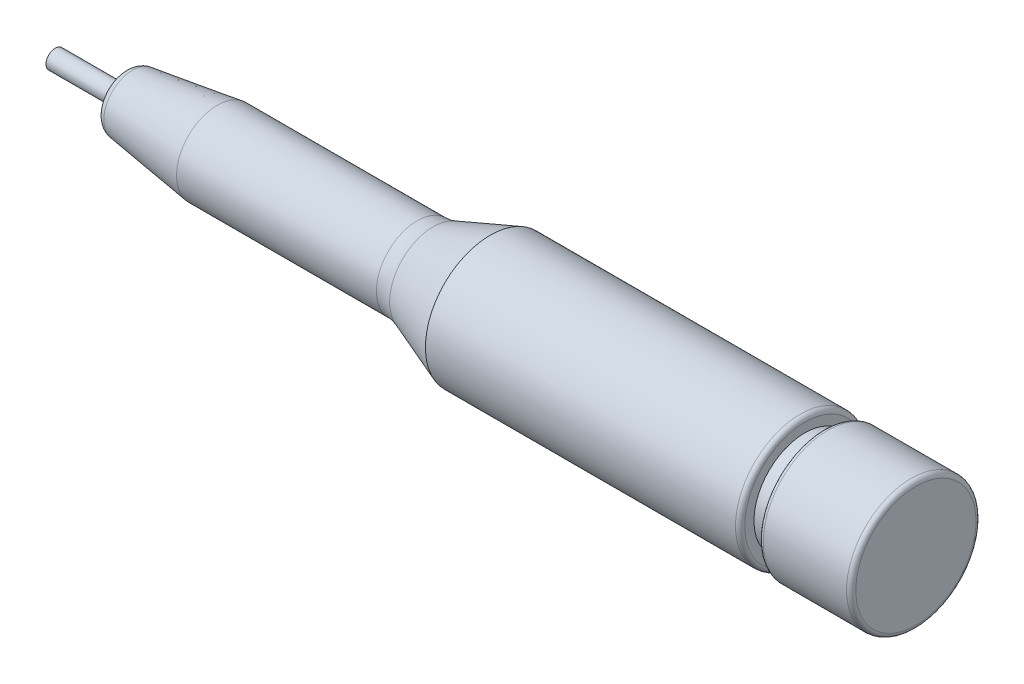
ISO-10303-21;
HEADER;
FILE_DESCRIPTION(('STEP AP214'),'2;1');
FILE_NAME('part.step','',(''),(''),'','','');
FILE_SCHEMA(('AUTOMOTIVE_DESIGN { 1 0 10303 214 1 1 1 1 }'));
ENDSEC;
DATA;
#1=APPLICATION_CONTEXT('core data for automotive mechanical design processes');
#2=APPLICATION_PROTOCOL_DEFINITION('international standard','automotive_design',2000,#1);
#3=PRODUCT_CONTEXT('',#1,'mechanical');
#4=PRODUCT('Part','Part','',(#3));
#5=PRODUCT_RELATED_PRODUCT_CATEGORY('part','',(#4));
#6=PRODUCT_DEFINITION_FORMATION('','',#4);
#7=PRODUCT_DEFINITION_CONTEXT('part definition',#1,'design');
#8=PRODUCT_DEFINITION('design','',#6,#7);
#9=PRODUCT_DEFINITION_SHAPE('','',#8);
#10=(LENGTH_UNIT() NAMED_UNIT(*) SI_UNIT(.MILLI.,.METRE.));
#11=(NAMED_UNIT(*) PLANE_ANGLE_UNIT() SI_UNIT($,.RADIAN.));
#12=(NAMED_UNIT(*) SI_UNIT($,.STERADIAN.) SOLID_ANGLE_UNIT());
#13=UNCERTAINTY_MEASURE_WITH_UNIT(LENGTH_MEASURE(1.E-05),#10,'distance_accuracy_value','');
#14=(GEOMETRIC_REPRESENTATION_CONTEXT(3) GLOBAL_UNCERTAINTY_ASSIGNED_CONTEXT((#13)) GLOBAL_UNIT_ASSIGNED_CONTEXT((#10,
#11,#12)) REPRESENTATION_CONTEXT('',''));
#15=CARTESIAN_POINT('',(0.,0.,0.));
#16=DIRECTION('',(0.,0.,1.));
#17=DIRECTION('',(1.,0.,0.));
#18=AXIS2_PLACEMENT_3D('',#15,#16,#17);
#19=CARTESIAN_POINT('',(0.,0.,0.));
#20=DIRECTION('',(-1.,0.,0.));
#21=DIRECTION('',(0.,0.,0.999999999999999));
#22=AXIS2_PLACEMENT_3D('',#19,#20,#21);
#23=PLANE('',#22);
#24=CARTESIAN_POINT('',(0.,0.,0.));
#25=DIRECTION('',(1.,0.,0.));
#26=DIRECTION('',(0.,0.,-0.999999999999999));
#27=AXIS2_PLACEMENT_3D('',#24,#25,#26);
#28=CIRCLE('',#27,1.);
#29=CARTESIAN_POINT('',(0.,0.,-0.999999999999999));
#30=VERTEX_POINT('',#29);
#31=EDGE_CURVE('E86',#30,#30,#28,.T.);
#32=ORIENTED_EDGE('',*,*,#31,.F.);
#33=EDGE_LOOP('',(#32));
#34=FACE_BOUND('',#33,.T.);
#35=ADVANCED_FACE('F48',(#34),#23,.T.);
#36=CARTESIAN_POINT('',(93.,0.,0.));
#37=DIRECTION('',(1.,0.,0.));
#38=DIRECTION('',(0.,0.,-0.999999999999999));
#39=AXIS2_PLACEMENT_3D('',#36,#37,#38);
#40=CYLINDRICAL_SURFACE('',#39,1.);
#41=ORIENTED_EDGE('',*,*,#31,.T.);
#42=EDGE_LOOP('',(#41));
#43=FACE_BOUND('',#42,.T.);
#44=CARTESIAN_POINT('',(7.50000000000001,0.,0.));
#45=DIRECTION('',(1.,0.,0.));
#46=DIRECTION('',(0.,0.,-0.999999999999999));
#47=AXIS2_PLACEMENT_3D('',#44,#45,#46);
#48=CIRCLE('',#47,1.);
#49=CARTESIAN_POINT('',(7.50000000000001,0.,-0.999999999999999));
#50=VERTEX_POINT('',#49);
#51=EDGE_CURVE('E89',#50,#50,#48,.T.);
#52=ORIENTED_EDGE('',*,*,#51,.F.);
#53=EDGE_LOOP('',(#52));
#54=FACE_BOUND('',#53,.T.);
#55=ADVANCED_FACE('F122',(#43,#54),#40,.T.);
#56=CARTESIAN_POINT('',(7.50000000000001,1.00000000000001,0.));
#57=DIRECTION('',(-1.,0.,0.));
#58=DIRECTION('',(0.,0.,0.999999999999999));
#59=AXIS2_PLACEMENT_3D('',#56,#57,#58);
#60=PLANE('',#59);
#61=CARTESIAN_POINT('',(7.50000000000001,0.,0.));
#62=DIRECTION('',(-1.,0.,0.));
#63=DIRECTION('',(0.,0.,0.999999999999999));
#64=AXIS2_PLACEMENT_3D('',#61,#62,#63);
#65=CIRCLE('',#64,2.13024755509085);
#66=CARTESIAN_POINT('',(7.50000000000001,0.,2.13024755509085));
#67=VERTEX_POINT('',#66);
#68=EDGE_CURVE('E74',#67,#67,#65,.T.);
#69=ORIENTED_EDGE('',*,*,#68,.T.);
#70=EDGE_LOOP('',(#69));
#71=FACE_BOUND('',#70,.T.);
#72=ORIENTED_EDGE('',*,*,#51,.T.);
#73=EDGE_LOOP('',(#72));
#74=FACE_BOUND('',#73,.T.);
#75=ADVANCED_FACE('F128',(#71,#74),#60,.T.);
#76=CARTESIAN_POINT('',(17.5,0.,0.));
#77=DIRECTION('',(1.,0.,0.));
#78=DIRECTION('',(0.,0.,-0.999999999999999));
#79=AXIS2_PLACEMENT_3D('',#76,#77,#78);
#80=CONICAL_SURFACE('',#79,4.4,0.139095941482071);
#81=CARTESIAN_POINT('',(8.3613521554656,0.,0.));
#82=DIRECTION('',(-1.,0.,0.));
#83=DIRECTION('',(0.,0.,0.999999999999999));
#84=AXIS2_PLACEMENT_3D('',#81,#82,#83);
#85=CIRCLE('',#84,3.12058930176518);
#86=CARTESIAN_POINT('',(8.3613521554656,0.,3.12058930176518));
#87=VERTEX_POINT('',#86);
#88=EDGE_CURVE('E77',#87,#87,#85,.F.);
#89=ORIENTED_EDGE('',*,*,#88,.T.);
#90=EDGE_LOOP('',(#89));
#91=FACE_BOUND('',#90,.T.);
#92=CARTESIAN_POINT('',(17.5,0.,0.));
#93=DIRECTION('',(1.,0.,0.));
#94=DIRECTION('',(0.,0.,-0.999999999999999));
#95=AXIS2_PLACEMENT_3D('',#92,#93,#94);
#96=CIRCLE('',#95,4.4);
#97=CARTESIAN_POINT('',(17.5,0.,-4.39999999999999));
#98=VERTEX_POINT('',#97);
#99=EDGE_CURVE('E92',#98,#98,#96,.T.);
#100=ORIENTED_EDGE('',*,*,#99,.F.);
#101=EDGE_LOOP('',(#100));
#102=FACE_BOUND('',#101,.T.);
#103=ADVANCED_FACE('F211',(#91,#102),#80,.T.);
#104=CARTESIAN_POINT('',(93.,0.,0.));
#105=DIRECTION('',(1.,0.,0.));
#106=DIRECTION('',(0.,0.,-0.999999999999999));
#107=AXIS2_PLACEMENT_3D('',#104,#105,#106);
#108=CYLINDRICAL_SURFACE('',#107,4.4);
#109=CARTESIAN_POINT('',(39.1014194595427,0.,0.));
#110=DIRECTION('',(1.,0.,0.));
#111=DIRECTION('',(0.,0.,-0.999999999999999));
#112=AXIS2_PLACEMENT_3D('',#109,#110,#111);
#113=CIRCLE('',#112,4.4);
#114=CARTESIAN_POINT('',(39.1014194595427,0.,-4.39999999999999));
#115=VERTEX_POINT('',#114);
#116=EDGE_CURVE('E80',#115,#115,#113,.F.);
#117=ORIENTED_EDGE('',*,*,#116,.T.);
#118=EDGE_LOOP('',(#117));
#119=FACE_BOUND('',#118,.T.);
#120=ORIENTED_EDGE('',*,*,#99,.T.);
#121=EDGE_LOOP('',(#120));
#122=FACE_BOUND('',#121,.T.);
#123=ADVANCED_FACE('F201',(#119,#122),#108,.T.);
#124=CARTESIAN_POINT('',(47.,0.,0.));
#125=DIRECTION('',(1.,0.,0.));
#126=DIRECTION('',(0.,0.,-0.999999999999999));
#127=AXIS2_PLACEMENT_3D('',#124,#125,#126);
#128=CONICAL_SURFACE('',#127,7.,0.35563588430076);
#129=CARTESIAN_POINT('',(40.8423521075608,0.,0.));
#130=DIRECTION('',(1.,0.,0.));
#131=DIRECTION('',(0.,0.,-0.999999999999999));
#132=AXIS2_PLACEMENT_3D('',#129,#130,#131);
#133=CIRCLE('',#132,4.71287363995117);
#134=CARTESIAN_POINT('',(40.8423521075608,0.,-4.71287363995117));
#135=VERTEX_POINT('',#134);
#136=EDGE_CURVE('E83',#135,#135,#133,.T.);
#137=ORIENTED_EDGE('',*,*,#136,.T.);
#138=EDGE_LOOP('',(#137));
#139=FACE_BOUND('',#138,.T.);
#140=CARTESIAN_POINT('',(47.,0.,0.));
#141=DIRECTION('',(1.,0.,0.));
#142=DIRECTION('',(0.,0.,-0.999999999999999));
#143=AXIS2_PLACEMENT_3D('',#140,#141,#142);
#144=CIRCLE('',#143,7.);
#145=CARTESIAN_POINT('',(47.,0.,-6.99999999999999));
#146=VERTEX_POINT('',#145);
#147=EDGE_CURVE('E95',#146,#146,#144,.T.);
#148=ORIENTED_EDGE('',*,*,#147,.F.);
#149=EDGE_LOOP('',(#148));
#150=FACE_BOUND('',#149,.T.);
#151=ADVANCED_FACE('F192',(#139,#150),#128,.T.);
#152=CARTESIAN_POINT('',(93.,0.,0.));
#153=DIRECTION('',(1.,0.,0.));
#154=DIRECTION('',(0.,0.,-0.999999999999999));
#155=AXIS2_PLACEMENT_3D('',#152,#153,#154);
#156=CYLINDRICAL_SURFACE('',#155,7.);
#157=CARTESIAN_POINT('',(80.5,0.,0.));
#158=DIRECTION('',(1.,0.,0.));
#159=DIRECTION('',(0.,0.,-0.999999999999999));
#160=AXIS2_PLACEMENT_3D('',#157,#158,#159);
#161=CIRCLE('',#160,7.);
#162=CARTESIAN_POINT('',(80.5,0.,-6.99999999999999));
#163=VERTEX_POINT('',#162);
#164=EDGE_CURVE('E68',#163,#163,#161,.F.);
#165=ORIENTED_EDGE('',*,*,#164,.T.);
#166=EDGE_LOOP('',(#165));
#167=FACE_BOUND('',#166,.T.);
#168=ORIENTED_EDGE('',*,*,#147,.T.);
#169=EDGE_LOOP('',(#168));
#170=FACE_BOUND('',#169,.T.);
#171=ADVANCED_FACE('F118',(#167,#170),#156,.T.);
#172=CARTESIAN_POINT('',(81.,7.00000000000001,0.));
#173=DIRECTION('',(1.,0.,0.));
#174=DIRECTION('',(0.,0.,-0.999999999999999));
#175=AXIS2_PLACEMENT_3D('',#172,#173,#174);
#176=PLANE('',#175);
#177=CARTESIAN_POINT('',(81.,0.,0.));
#178=DIRECTION('',(1.,0.,0.));
#179=DIRECTION('',(0.,0.,-0.999999999999999));
#180=AXIS2_PLACEMENT_3D('',#177,#178,#179);
#181=CIRCLE('',#180,6.5);
#182=CARTESIAN_POINT('',(81.,0.,-6.49999999999999));
#183=VERTEX_POINT('',#182);
#184=EDGE_CURVE('E71',#183,#183,#181,.T.);
#185=ORIENTED_EDGE('',*,*,#184,.T.);
#186=EDGE_LOOP('',(#185));
#187=FACE_BOUND('',#186,.T.);
#188=CARTESIAN_POINT('',(81.,0.,0.));
#189=DIRECTION('',(1.,0.,0.));
#190=DIRECTION('',(0.,0.,-0.999999999999999));
#191=AXIS2_PLACEMENT_3D('',#188,#189,#190);
#192=CIRCLE('',#191,5.5);
#193=CARTESIAN_POINT('',(81.,0.,-5.49999999999999));
#194=VERTEX_POINT('',#193);
#195=EDGE_CURVE('E98',#194,#194,#192,.T.);
#196=ORIENTED_EDGE('',*,*,#195,.F.);
#197=EDGE_LOOP('',(#196));
#198=FACE_BOUND('',#197,.T.);
#199=ADVANCED_FACE('F109',(#187,#198),#176,.T.);
#200=CARTESIAN_POINT('',(93.,0.,0.));
#201=DIRECTION('',(1.,0.,0.));
#202=DIRECTION('',(0.,0.,-0.999999999999999));
#203=AXIS2_PLACEMENT_3D('',#200,#201,#202);
#204=CYLINDRICAL_SURFACE('',#203,5.5);
#205=ORIENTED_EDGE('',*,*,#195,.T.);
#206=EDGE_LOOP('',(#205));
#207=FACE_BOUND('',#206,.T.);
#208=CARTESIAN_POINT('',(83.,0.,0.));
#209=DIRECTION('',(1.,0.,0.));
#210=DIRECTION('',(0.,0.,-0.999999999999999));
#211=AXIS2_PLACEMENT_3D('',#208,#209,#210);
#212=CIRCLE('',#211,5.5);
#213=CARTESIAN_POINT('',(83.,0.,-5.49999999999999));
#214=VERTEX_POINT('',#213);
#215=EDGE_CURVE('E101',#214,#214,#212,.T.);
#216=ORIENTED_EDGE('',*,*,#215,.F.);
#217=EDGE_LOOP('',(#216));
#218=FACE_BOUND('',#217,.T.);
#219=ADVANCED_FACE('F107',(#207,#218),#204,.T.);
#220=CARTESIAN_POINT('',(83.,5.50000000000001,0.));
#221=DIRECTION('',(-1.,0.,0.));
#222=DIRECTION('',(0.,0.,0.999999999999999));
#223=AXIS2_PLACEMENT_3D('',#220,#221,#222);
#224=PLANE('',#223);
#225=CARTESIAN_POINT('',(83.,0.,0.));
#226=DIRECTION('',(-1.,0.,0.));
#227=DIRECTION('',(0.,0.,0.999999999999999));
#228=AXIS2_PLACEMENT_3D('',#225,#226,#227);
#229=CIRCLE('',#228,6.5);
#230=CARTESIAN_POINT('',(83.,0.,6.49999999999999));
#231=VERTEX_POINT('',#230);
#232=EDGE_CURVE('E12',#231,#231,#229,.T.);
#233=ORIENTED_EDGE('',*,*,#232,.T.);
#234=EDGE_LOOP('',(#233));
#235=FACE_BOUND('',#234,.T.);
#236=ORIENTED_EDGE('',*,*,#215,.T.);
#237=EDGE_LOOP('',(#236));
#238=FACE_BOUND('',#237,.T.);
#239=ADVANCED_FACE('F105',(#235,#238),#224,.T.);
#240=CARTESIAN_POINT('',(93.,0.,0.));
#241=DIRECTION('',(1.,0.,0.));
#242=DIRECTION('',(0.,0.,-0.999999999999999));
#243=AXIS2_PLACEMENT_3D('',#240,#241,#242);
#244=CYLINDRICAL_SURFACE('',#243,7.);
#245=CARTESIAN_POINT('',(92.5,0.,0.));
#246=DIRECTION('',(1.,0.,0.));
#247=DIRECTION('',(0.,0.,-0.999999999999999));
#248=AXIS2_PLACEMENT_3D('',#245,#246,#247);
#249=CIRCLE('',#248,7.);
#250=CARTESIAN_POINT('',(92.5,0.,-6.99999999999999));
#251=VERTEX_POINT('',#250);
#252=EDGE_CURVE('E55',#251,#251,#249,.F.);
#253=ORIENTED_EDGE('',*,*,#252,.T.);
#254=EDGE_LOOP('',(#253));
#255=FACE_BOUND('',#254,.T.);
#256=CARTESIAN_POINT('',(83.5,0.,0.));
#257=DIRECTION('',(-1.,0.,0.));
#258=DIRECTION('',(0.,0.,0.999999999999999));
#259=AXIS2_PLACEMENT_3D('',#256,#257,#258);
#260=CIRCLE('',#259,7.);
#261=CARTESIAN_POINT('',(83.5,0.,6.99999999999999));
#262=VERTEX_POINT('',#261);
#263=EDGE_CURVE('E59',#262,#262,#260,.F.);
#264=ORIENTED_EDGE('',*,*,#263,.T.);
#265=EDGE_LOOP('',(#264));
#266=FACE_BOUND('',#265,.T.);
#267=ADVANCED_FACE('F116',(#255,#266),#244,.T.);
#268=CARTESIAN_POINT('',(93.,7.00000000000001,0.));
#269=DIRECTION('',(1.,0.,0.));
#270=DIRECTION('',(0.,0.,-0.999999999999999));
#271=AXIS2_PLACEMENT_3D('',#268,#269,#270);
#272=PLANE('',#271);
#273=CARTESIAN_POINT('',(93.,0.,0.));
#274=DIRECTION('',(1.,0.,0.));
#275=DIRECTION('',(0.,0.,-0.999999999999999));
#276=AXIS2_PLACEMENT_3D('',#273,#274,#275);
#277=CIRCLE('',#276,6.5);
#278=CARTESIAN_POINT('',(93.,0.,-6.49999999999999));
#279=VERTEX_POINT('',#278);
#280=EDGE_CURVE('E63',#279,#279,#277,.T.);
#281=ORIENTED_EDGE('',*,*,#280,.T.);
#282=EDGE_LOOP('',(#281));
#283=FACE_BOUND('',#282,.T.);
#284=ADVANCED_FACE('F138',(#283),#272,.T.);
#285=CARTESIAN_POINT('',(39.1014194595427,0.,0.));
#286=DIRECTION('',(1.,0.,0.));
#287=DIRECTION('',(0.,0.,-0.999999999999999));
#288=AXIS2_PLACEMENT_3D('',#285,#286,#287);
#289=TOROIDAL_SURFACE('',#288,9.4,5.);
#290=ORIENTED_EDGE('',*,*,#116,.F.);
#291=EDGE_LOOP('',(#290));
#292=FACE_BOUND('',#291,.T.);
#293=ORIENTED_EDGE('',*,*,#136,.F.);
#294=EDGE_LOOP('',(#293));
#295=FACE_BOUND('',#294,.T.);
#296=ADVANCED_FACE('F134',(#292,#295),#289,.F.);
#297=CARTESIAN_POINT('',(8.50000000000001,0.,0.));
#298=DIRECTION('',(-1.,0.,0.));
#299=DIRECTION('',(0.,0.,0.999999999999999));
#300=AXIS2_PLACEMENT_3D('',#297,#298,#299);
#301=TOROIDAL_SURFACE('',#300,2.13024755509085,1.);
#302=ORIENTED_EDGE('',*,*,#68,.F.);
#303=EDGE_LOOP('',(#302));
#304=FACE_BOUND('',#303,.T.);
#305=ORIENTED_EDGE('',*,*,#88,.F.);
#306=EDGE_LOOP('',(#305));
#307=FACE_BOUND('',#306,.T.);
#308=ADVANCED_FACE('F137',(#304,#307),#301,.T.);
#309=CARTESIAN_POINT('',(80.5,0.,0.));
#310=DIRECTION('',(1.,0.,0.));
#311=DIRECTION('',(0.,0.,-0.999999999999999));
#312=AXIS2_PLACEMENT_3D('',#309,#310,#311);
#313=TOROIDAL_SURFACE('',#312,6.5,0.5);
#314=ORIENTED_EDGE('',*,*,#164,.F.);
#315=EDGE_LOOP('',(#314));
#316=FACE_BOUND('',#315,.T.);
#317=ORIENTED_EDGE('',*,*,#184,.F.);
#318=EDGE_LOOP('',(#317));
#319=FACE_BOUND('',#318,.T.);
#320=ADVANCED_FACE('F142',(#316,#319),#313,.T.);
#321=CARTESIAN_POINT('',(92.5,0.,0.));
#322=DIRECTION('',(1.,0.,0.));
#323=DIRECTION('',(0.,0.,-0.999999999999999));
#324=AXIS2_PLACEMENT_3D('',#321,#322,#323);
#325=TOROIDAL_SURFACE('',#324,6.5,0.5);
#326=ORIENTED_EDGE('',*,*,#252,.F.);
#327=EDGE_LOOP('',(#326));
#328=FACE_BOUND('',#327,.T.);
#329=ORIENTED_EDGE('',*,*,#280,.F.);
#330=EDGE_LOOP('',(#329));
#331=FACE_BOUND('',#330,.T.);
#332=ADVANCED_FACE('F145',(#328,#331),#325,.T.);
#333=CARTESIAN_POINT('',(83.5,0.,0.));
#334=DIRECTION('',(-1.,0.,0.));
#335=DIRECTION('',(0.,0.,0.999999999999999));
#336=AXIS2_PLACEMENT_3D('',#333,#334,#335);
#337=TOROIDAL_SURFACE('',#336,6.5,0.5);
#338=ORIENTED_EDGE('',*,*,#232,.F.);
#339=EDGE_LOOP('',(#338));
#340=FACE_BOUND('',#339,.T.);
#341=ORIENTED_EDGE('',*,*,#263,.F.);
#342=EDGE_LOOP('',(#341));
#343=FACE_BOUND('',#342,.T.);
#344=ADVANCED_FACE('F50',(#340,#343),#337,.T.);
#345=CLOSED_SHELL('',(#35,#55,#75,#103,#123,#151,#171,#199,#219,#239,#267,#284,#296,#308,#320,
#332,#344));
#346=MANIFOLD_SOLID_BREP('B2',#345);
#347=ADVANCED_BREP_SHAPE_REPRESENTATION('',(#18,#346),#14);
#348=SHAPE_DEFINITION_REPRESENTATION(#9,#347);
ENDSEC;
END-ISO-10303-21;
